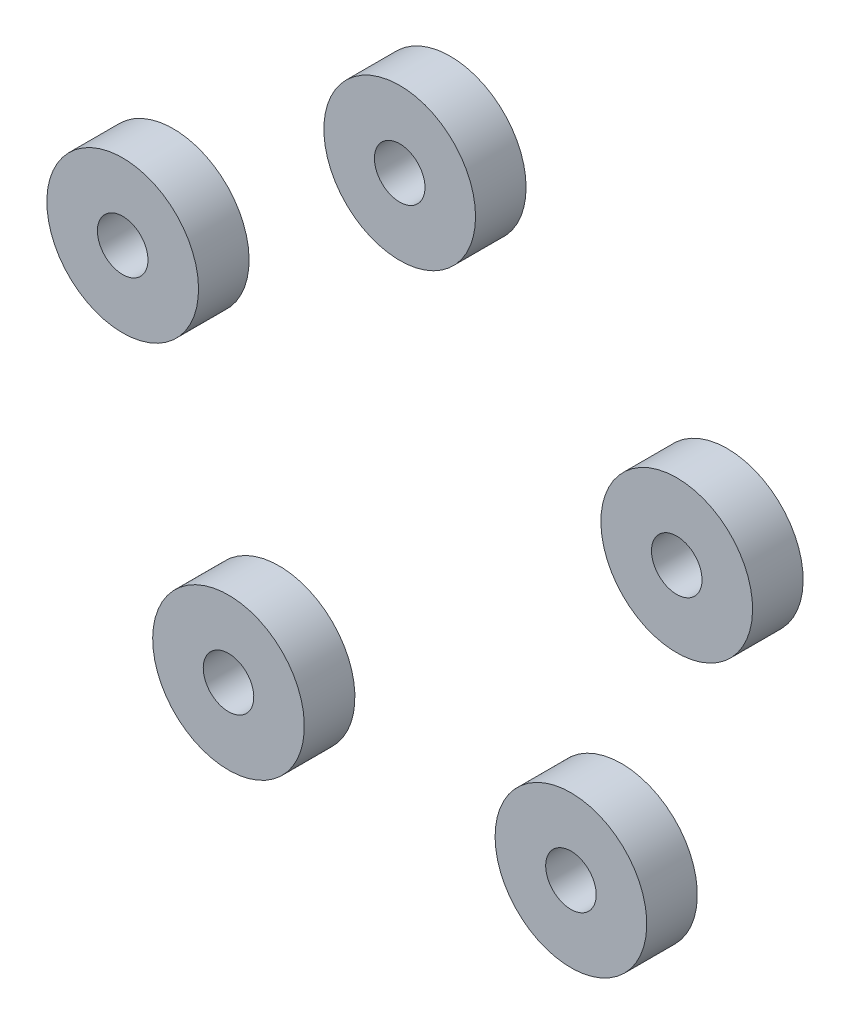
ISO-10303-21;
HEADER;
FILE_DESCRIPTION(('STEP AP214'),'2;1');
FILE_NAME('part.step','',(''),(''),'','','');
FILE_SCHEMA(('AUTOMOTIVE_DESIGN { 1 0 10303 214 1 1 1 1 }'));
ENDSEC;
DATA;
#1=APPLICATION_CONTEXT('core data for automotive mechanical design processes');
#2=APPLICATION_PROTOCOL_DEFINITION('international standard','automotive_design',2000,#1);
#3=PRODUCT_CONTEXT('',#1,'mechanical');
#4=PRODUCT('Part','Part','',(#3));
#5=PRODUCT_RELATED_PRODUCT_CATEGORY('part','',(#4));
#6=PRODUCT_DEFINITION_FORMATION('','',#4);
#7=PRODUCT_DEFINITION_CONTEXT('part definition',#1,'design');
#8=PRODUCT_DEFINITION('design','',#6,#7);
#9=PRODUCT_DEFINITION_SHAPE('','',#8);
#10=(LENGTH_UNIT() NAMED_UNIT(*) SI_UNIT(.MILLI.,.METRE.));
#11=(NAMED_UNIT(*) PLANE_ANGLE_UNIT() SI_UNIT($,.RADIAN.));
#12=(NAMED_UNIT(*) SI_UNIT($,.STERADIAN.) SOLID_ANGLE_UNIT());
#13=UNCERTAINTY_MEASURE_WITH_UNIT(LENGTH_MEASURE(1.E-05),#10,'distance_accuracy_value','');
#14=(GEOMETRIC_REPRESENTATION_CONTEXT(3) GLOBAL_UNCERTAINTY_ASSIGNED_CONTEXT((#13)) GLOBAL_UNIT_ASSIGNED_CONTEXT((#10,
#11,#12)) REPRESENTATION_CONTEXT('',''));
#15=CARTESIAN_POINT('',(0.,0.,0.));
#16=DIRECTION('',(0.,0.,1.));
#17=DIRECTION('',(1.,0.,0.));
#18=AXIS2_PLACEMENT_3D('',#15,#16,#17);
#19=CARTESIAN_POINT('',(-0.000964230025357615,23.8101388008813,6.));
#20=DIRECTION('',(0.,0.,1.));
#21=DIRECTION('',(1.,0.,0.));
#22=AXIS2_PLACEMENT_3D('',#19,#20,#21);
#23=PLANE('',#22);
#24=CARTESIAN_POINT('',(-0.000964230025357613,23.0462760167501,6.));
#25=DIRECTION('',(0.,0.,1.));
#26=DIRECTION('',(-1.,0.,0.));
#27=AXIS2_PLACEMENT_3D('',#24,#25,#26);
#28=CIRCLE('',#27,6.);
#29=CARTESIAN_POINT('',(5.99903576997464,23.0462760167501,6.));
#30=VERTEX_POINT('',#29);
#31=EDGE_CURVE('P0_E11',#30,#30,#28,.T.);
#32=ORIENTED_EDGE('',*,*,#31,.T.);
#33=EDGE_LOOP('',(#32));
#34=FACE_BOUND('',#33,.T.);
#35=CARTESIAN_POINT('',(-0.000964230025357613,23.0462760167501,6.));
#36=DIRECTION('',(0.,0.,-1.));
#37=DIRECTION('',(-1.,0.,0.));
#38=AXIS2_PLACEMENT_3D('',#35,#36,#37);
#39=CIRCLE('',#38,2.);
#40=CARTESIAN_POINT('',(1.99903576997464,23.0462760167501,6.));
#41=VERTEX_POINT('',#40);
#42=EDGE_CURVE('P0_E26',#41,#41,#39,.T.);
#43=ORIENTED_EDGE('',*,*,#42,.T.);
#44=EDGE_LOOP('',(#43));
#45=FACE_BOUND('',#44,.T.);
#46=ADVANCED_FACE('P0_F16',(#34,#45),#23,.T.);
#47=CARTESIAN_POINT('',(-0.000964230025357613,23.0462760167501,2.));
#48=DIRECTION('',(0.,0.,1.));
#49=DIRECTION('',(-1.,0.,0.));
#50=AXIS2_PLACEMENT_3D('',#47,#48,#49);
#51=CYLINDRICAL_SURFACE('',#50,6.);
#52=ORIENTED_EDGE('',*,*,#31,.F.);
#53=DIRECTION('',(0.,0.,-1.));
#54=VECTOR('',#53,1.);
#55=CARTESIAN_POINT('',(5.99903576997464,23.0462760167501,2.));
#56=LINE('',#55,#54);
#57=CARTESIAN_POINT('',(5.99903576997464,23.0462760167501,2.));
#58=VERTEX_POINT('',#57);
#59=EDGE_CURVE('P0_E66',#30,#58,#56,.T.);
#60=ORIENTED_EDGE('',*,*,#59,.T.);
#61=CARTESIAN_POINT('',(-0.000964230025357613,23.0462760167501,2.));
#62=DIRECTION('',(0.,0.,1.));
#63=DIRECTION('',(-1.,0.,0.));
#64=AXIS2_PLACEMENT_3D('',#61,#62,#63);
#65=CIRCLE('',#64,6.);
#66=EDGE_CURVE('P0_E60',#58,#58,#65,.T.);
#67=ORIENTED_EDGE('',*,*,#66,.T.);
#68=ORIENTED_EDGE('',*,*,#59,.F.);
#69=EDGE_LOOP('',(#52,#60,#67,#68));
#70=FACE_BOUND('',#69,.T.);
#71=ADVANCED_FACE('P0_F78',(#70),#51,.T.);
#72=CARTESIAN_POINT('',(-0.000964230025357613,23.0462760167501,2.));
#73=DIRECTION('',(0.,0.,1.));
#74=DIRECTION('',(-1.,0.,0.));
#75=AXIS2_PLACEMENT_3D('',#72,#73,#74);
#76=CYLINDRICAL_SURFACE('',#75,2.);
#77=ORIENTED_EDGE('',*,*,#42,.F.);
#78=DIRECTION('',(0.,0.,-1.));
#79=VECTOR('',#78,1.);
#80=CARTESIAN_POINT('',(1.99903576997464,23.0462760167501,2.));
#81=LINE('',#80,#79);
#82=CARTESIAN_POINT('',(1.99903576997464,23.0462760167501,2.));
#83=VERTEX_POINT('',#82);
#84=EDGE_CURVE('P0_E20',#41,#83,#81,.T.);
#85=ORIENTED_EDGE('',*,*,#84,.T.);
#86=CARTESIAN_POINT('',(-0.000964230025357613,23.0462760167501,2.));
#87=DIRECTION('',(0.,0.,-1.));
#88=DIRECTION('',(-1.,0.,0.));
#89=AXIS2_PLACEMENT_3D('',#86,#87,#88);
#90=CIRCLE('',#89,2.);
#91=EDGE_CURVE('P0_E56',#83,#83,#90,.T.);
#92=ORIENTED_EDGE('',*,*,#91,.T.);
#93=ORIENTED_EDGE('',*,*,#84,.F.);
#94=EDGE_LOOP('',(#77,#85,#92,#93));
#95=FACE_BOUND('',#94,.T.);
#96=ADVANCED_FACE('P0_F58',(#95),#76,.F.);
#97=CARTESIAN_POINT('',(-0.000964230025357615,23.8101388008813,2.));
#98=DIRECTION('',(0.,0.,1.));
#99=DIRECTION('',(1.,0.,0.));
#100=AXIS2_PLACEMENT_3D('',#97,#98,#99);
#101=PLANE('',#100);
#102=ORIENTED_EDGE('',*,*,#66,.F.);
#103=EDGE_LOOP('',(#102));
#104=FACE_BOUND('',#103,.T.);
#105=ORIENTED_EDGE('',*,*,#91,.F.);
#106=EDGE_LOOP('',(#105));
#107=FACE_BOUND('',#106,.T.);
#108=ADVANCED_FACE('P0_F18',(#104,#107),#101,.F.);
#109=CLOSED_SHELL('',(#46,#71,#96,#108));
#110=MANIFOLD_SOLID_BREP('P0_B1',#109);
#111=CARTESIAN_POINT('',(-22.6450856239346,7.35682049064984,6.));
#112=DIRECTION('',(0.,0.,1.));
#113=DIRECTION('',(1.,0.,0.));
#114=AXIS2_PLACEMENT_3D('',#111,#112,#113);
#115=PLANE('',#114);
#116=CARTESIAN_POINT('',(-21.9186089455312,7.12077390898274,6.));
#117=DIRECTION('',(0.,0.,1.));
#118=DIRECTION('',(-0.309016994374948,-0.951056516295154,0.));
#119=AXIS2_PLACEMENT_3D('',#116,#117,#118);
#120=CIRCLE('',#119,6.);
#121=CARTESIAN_POINT('',(-20.0645069792816,12.8271130067537,6.));
#122=VERTEX_POINT('',#121);
#123=EDGE_CURVE('P1_E11',#122,#122,#120,.T.);
#124=ORIENTED_EDGE('',*,*,#123,.T.);
#125=EDGE_LOOP('',(#124));
#126=FACE_BOUND('',#125,.T.);
#127=CARTESIAN_POINT('',(-21.9186089455312,7.12077390898274,6.));
#128=DIRECTION('',(0.,0.,-1.));
#129=DIRECTION('',(-0.309016994374948,-0.951056516295154,0.));
#130=AXIS2_PLACEMENT_3D('',#127,#128,#129);
#131=CIRCLE('',#130,2.);
#132=CARTESIAN_POINT('',(-21.3005749567813,9.02288694157304,6.));
#133=VERTEX_POINT('',#132);
#134=EDGE_CURVE('P1_E26',#133,#133,#131,.T.);
#135=ORIENTED_EDGE('',*,*,#134,.T.);
#136=EDGE_LOOP('',(#135));
#137=FACE_BOUND('',#136,.T.);
#138=ADVANCED_FACE('P1_F16',(#126,#137),#115,.T.);
#139=CARTESIAN_POINT('',(-21.9186089455312,7.12077390898274,2.));
#140=DIRECTION('',(0.,0.,1.));
#141=DIRECTION('',(-0.309016994374948,-0.951056516295154,0.));
#142=AXIS2_PLACEMENT_3D('',#139,#140,#141);
#143=CYLINDRICAL_SURFACE('',#142,6.);
#144=ORIENTED_EDGE('',*,*,#123,.F.);
#145=DIRECTION('',(0.,0.,-1.));
#146=VECTOR('',#145,1.);
#147=CARTESIAN_POINT('',(-20.0645069792816,12.8271130067537,2.));
#148=LINE('',#147,#146);
#149=CARTESIAN_POINT('',(-20.0645069792816,12.8271130067537,2.));
#150=VERTEX_POINT('',#149);
#151=EDGE_CURVE('P1_E19',#122,#150,#148,.T.);
#152=ORIENTED_EDGE('',*,*,#151,.T.);
#153=CARTESIAN_POINT('',(-21.9186089455312,7.12077390898274,2.));
#154=DIRECTION('',(0.,0.,1.));
#155=DIRECTION('',(-0.309016994374948,-0.951056516295154,0.));
#156=AXIS2_PLACEMENT_3D('',#153,#154,#155);
#157=CIRCLE('',#156,6.);
#158=EDGE_CURVE('P1_E47',#150,#150,#157,.T.);
#159=ORIENTED_EDGE('',*,*,#158,.T.);
#160=ORIENTED_EDGE('',*,*,#151,.F.);
#161=EDGE_LOOP('',(#144,#152,#159,#160));
#162=FACE_BOUND('',#161,.T.);
#163=ADVANCED_FACE('P1_F78',(#162),#143,.T.);
#164=CARTESIAN_POINT('',(-21.9186089455312,7.12077390898274,2.));
#165=DIRECTION('',(0.,0.,1.));
#166=DIRECTION('',(-0.309016994374948,-0.951056516295154,0.));
#167=AXIS2_PLACEMENT_3D('',#164,#165,#166);
#168=CYLINDRICAL_SURFACE('',#167,2.);
#169=ORIENTED_EDGE('',*,*,#134,.F.);
#170=DIRECTION('',(0.,0.,-1.));
#171=VECTOR('',#170,1.);
#172=CARTESIAN_POINT('',(-21.3005749567813,9.02288694157304,2.));
#173=LINE('',#172,#171);
#174=CARTESIAN_POINT('',(-21.3005749567813,9.02288694157304,2.));
#175=VERTEX_POINT('',#174);
#176=EDGE_CURVE('P1_E60',#133,#175,#173,.T.);
#177=ORIENTED_EDGE('',*,*,#176,.T.);
#178=CARTESIAN_POINT('',(-21.9186089455312,7.12077390898274,2.));
#179=DIRECTION('',(0.,0.,-1.));
#180=DIRECTION('',(-0.309016994374948,-0.951056516295154,0.));
#181=AXIS2_PLACEMENT_3D('',#178,#179,#180);
#182=CIRCLE('',#181,2.);
#183=EDGE_CURVE('P1_E54',#175,#175,#182,.T.);
#184=ORIENTED_EDGE('',*,*,#183,.T.);
#185=ORIENTED_EDGE('',*,*,#176,.F.);
#186=EDGE_LOOP('',(#169,#177,#184,#185));
#187=FACE_BOUND('',#186,.T.);
#188=ADVANCED_FACE('P1_F62',(#187),#168,.F.);
#189=CARTESIAN_POINT('',(-22.6450856239346,7.35682049064984,2.));
#190=DIRECTION('',(0.,0.,1.));
#191=DIRECTION('',(1.,0.,0.));
#192=AXIS2_PLACEMENT_3D('',#189,#190,#191);
#193=PLANE('',#192);
#194=ORIENTED_EDGE('',*,*,#158,.F.);
#195=EDGE_LOOP('',(#194));
#196=FACE_BOUND('',#195,.T.);
#197=ORIENTED_EDGE('',*,*,#183,.F.);
#198=EDGE_LOOP('',(#197));
#199=FACE_BOUND('',#198,.T.);
#200=ADVANCED_FACE('P1_F56',(#196,#199),#193,.F.);
#201=CLOSED_SHELL('',(#138,#163,#188,#200));
#202=MANIFOLD_SOLID_BREP('P1_B1',#201);
#203=CARTESIAN_POINT('',(-13.9944683637178,-19.263373688528,6.));
#204=DIRECTION('',(0.,0.,1.));
#205=DIRECTION('',(1.,0.,0.));
#206=AXIS2_PLACEMENT_3D('',#203,#204,#205);
#207=PLANE('',#206);
#208=CARTESIAN_POINT('',(-13.5454810844304,-18.6453957147953,6.));
#209=DIRECTION('',(0.,0.,1.));
#210=DIRECTION('',(0.809016994374948,-0.587785252292473,0.));
#211=AXIS2_PLACEMENT_3D('',#208,#209,#210);
#212=CIRCLE('',#211,6.);
#213=CARTESIAN_POINT('',(-18.3995830506801,-15.1186842010405,6.));
#214=VERTEX_POINT('',#213);
#215=EDGE_CURVE('P2_E11',#214,#214,#212,.T.);
#216=ORIENTED_EDGE('',*,*,#215,.T.);
#217=EDGE_LOOP('',(#216));
#218=FACE_BOUND('',#217,.T.);
#219=CARTESIAN_POINT('',(-13.5454810844304,-18.6453957147953,6.));
#220=DIRECTION('',(0.,0.,-1.));
#221=DIRECTION('',(0.809016994374947,-0.587785252292473,0.));
#222=AXIS2_PLACEMENT_3D('',#219,#220,#221);
#223=CIRCLE('',#222,2.);
#224=CARTESIAN_POINT('',(-15.1635150731803,-17.4698252102104,6.));
#225=VERTEX_POINT('',#224);
#226=EDGE_CURVE('P2_E27',#225,#225,#223,.T.);
#227=ORIENTED_EDGE('',*,*,#226,.T.);
#228=EDGE_LOOP('',(#227));
#229=FACE_BOUND('',#228,.T.);
#230=ADVANCED_FACE('P2_F16',(#218,#229),#207,.T.);
#231=CARTESIAN_POINT('',(-13.5454810844304,-18.6453957147953,2.));
#232=DIRECTION('',(0.,0.,1.));
#233=DIRECTION('',(0.809016994374948,-0.587785252292473,0.));
#234=AXIS2_PLACEMENT_3D('',#231,#232,#233);
#235=CYLINDRICAL_SURFACE('',#234,6.);
#236=ORIENTED_EDGE('',*,*,#215,.F.);
#237=DIRECTION('',(0.,0.,-1.));
#238=VECTOR('',#237,1.);
#239=CARTESIAN_POINT('',(-18.3995830506801,-15.1186842010405,2.));
#240=LINE('',#239,#238);
#241=CARTESIAN_POINT('',(-18.3995830506801,-15.1186842010405,2.));
#242=VERTEX_POINT('',#241);
#243=EDGE_CURVE('P2_E67',#214,#242,#240,.T.);
#244=ORIENTED_EDGE('',*,*,#243,.T.);
#245=CARTESIAN_POINT('',(-13.5454810844304,-18.6453957147953,2.));
#246=DIRECTION('',(0.,0.,1.));
#247=DIRECTION('',(0.809016994374948,-0.587785252292473,0.));
#248=AXIS2_PLACEMENT_3D('',#245,#246,#247);
#249=CIRCLE('',#248,6.);
#250=EDGE_CURVE('P2_E48',#242,#242,#249,.T.);
#251=ORIENTED_EDGE('',*,*,#250,.T.);
#252=ORIENTED_EDGE('',*,*,#243,.F.);
#253=EDGE_LOOP('',(#236,#244,#251,#252));
#254=FACE_BOUND('',#253,.T.);
#255=ADVANCED_FACE('P2_F75',(#254),#235,.T.);
#256=CARTESIAN_POINT('',(-13.5454810844304,-18.6453957147953,2.));
#257=DIRECTION('',(0.,0.,1.));
#258=DIRECTION('',(0.809016994374947,-0.587785252292473,0.));
#259=AXIS2_PLACEMENT_3D('',#256,#257,#258);
#260=CYLINDRICAL_SURFACE('',#259,2.);
#261=ORIENTED_EDGE('',*,*,#226,.F.);
#262=DIRECTION('',(0.,0.,-1.));
#263=VECTOR('',#262,1.);
#264=CARTESIAN_POINT('',(-15.1635150731803,-17.4698252102104,2.));
#265=LINE('',#264,#263);
#266=CARTESIAN_POINT('',(-15.1635150731803,-17.4698252102104,2.));
#267=VERTEX_POINT('',#266);
#268=EDGE_CURVE('P2_E59',#225,#267,#265,.T.);
#269=ORIENTED_EDGE('',*,*,#268,.T.);
#270=CARTESIAN_POINT('',(-13.5454810844304,-18.6453957147953,2.));
#271=DIRECTION('',(0.,0.,-1.));
#272=DIRECTION('',(0.809016994374947,-0.587785252292473,0.));
#273=AXIS2_PLACEMENT_3D('',#270,#271,#272);
#274=CIRCLE('',#273,2.);
#275=EDGE_CURVE('P2_E20',#267,#267,#274,.T.);
#276=ORIENTED_EDGE('',*,*,#275,.T.);
#277=ORIENTED_EDGE('',*,*,#268,.F.);
#278=EDGE_LOOP('',(#261,#269,#276,#277));
#279=FACE_BOUND('',#278,.T.);
#280=ADVANCED_FACE('P2_F18',(#279),#260,.F.);
#281=CARTESIAN_POINT('',(-13.9944683637178,-19.263373688528,2.));
#282=DIRECTION('',(0.,0.,1.));
#283=DIRECTION('',(1.,0.,0.));
#284=AXIS2_PLACEMENT_3D('',#281,#282,#283);
#285=PLANE('',#284);
#286=ORIENTED_EDGE('',*,*,#250,.F.);
#287=EDGE_LOOP('',(#286));
#288=FACE_BOUND('',#287,.T.);
#289=ORIENTED_EDGE('',*,*,#275,.F.);
#290=EDGE_LOOP('',(#289));
#291=FACE_BOUND('',#290,.T.);
#292=ADVANCED_FACE('P2_F55',(#288,#291),#285,.F.);
#293=CLOSED_SHELL('',(#230,#255,#280,#292));
#294=MANIFOLD_SOLID_BREP('P2_B1',#293);
#295=CARTESIAN_POINT('',(22.6444896970059,7.35865456514748,6.));
#296=DIRECTION('',(0.,0.,1.));
#297=DIRECTION('',(1.,0.,0.));
#298=AXIS2_PLACEMENT_3D('',#295,#296,#297);
#299=PLANE('',#298);
#300=CARTESIAN_POINT('',(21.9180130186026,7.12260798348038,6.));
#301=DIRECTION('',(0.,0.,1.));
#302=DIRECTION('',(-0.309016994374947,0.951056516295154,0.));
#303=AXIS2_PLACEMENT_3D('',#300,#301,#302);
#304=CIRCLE('',#303,6.);
#305=CARTESIAN_POINT('',(23.7721149848523,1.41626888570945,6.));
#306=VERTEX_POINT('',#305);
#307=EDGE_CURVE('P3_E11',#306,#306,#304,.T.);
#308=ORIENTED_EDGE('',*,*,#307,.T.);
#309=EDGE_LOOP('',(#308));
#310=FACE_BOUND('',#309,.T.);
#311=CARTESIAN_POINT('',(21.9180130186026,7.12260798348038,6.));
#312=DIRECTION('',(0.,0.,-1.));
#313=DIRECTION('',(-0.309016994374947,0.951056516295154,0.));
#314=AXIS2_PLACEMENT_3D('',#311,#312,#313);
#315=CIRCLE('',#314,2.);
#316=CARTESIAN_POINT('',(22.5360470073525,5.22049495089007,6.));
#317=VERTEX_POINT('',#316);
#318=EDGE_CURVE('P3_E26',#317,#317,#315,.T.);
#319=ORIENTED_EDGE('',*,*,#318,.T.);
#320=EDGE_LOOP('',(#319));
#321=FACE_BOUND('',#320,.T.);
#322=ADVANCED_FACE('P3_F16',(#310,#321),#299,.T.);
#323=CARTESIAN_POINT('',(21.9180130186026,7.12260798348038,2.));
#324=DIRECTION('',(0.,0.,1.));
#325=DIRECTION('',(-0.309016994374947,0.951056516295154,0.));
#326=AXIS2_PLACEMENT_3D('',#323,#324,#325);
#327=CYLINDRICAL_SURFACE('',#326,6.);
#328=ORIENTED_EDGE('',*,*,#307,.F.);
#329=DIRECTION('',(0.,0.,-1.));
#330=VECTOR('',#329,1.);
#331=CARTESIAN_POINT('',(23.7721149848523,1.41626888570945,2.));
#332=LINE('',#331,#330);
#333=CARTESIAN_POINT('',(23.7721149848523,1.41626888570945,2.));
#334=VERTEX_POINT('',#333);
#335=EDGE_CURVE('P3_E20',#306,#334,#332,.T.);
#336=ORIENTED_EDGE('',*,*,#335,.T.);
#337=CARTESIAN_POINT('',(21.9180130186026,7.12260798348038,2.));
#338=DIRECTION('',(0.,0.,1.));
#339=DIRECTION('',(-0.309016994374947,0.951056516295154,0.));
#340=AXIS2_PLACEMENT_3D('',#337,#338,#339);
#341=CIRCLE('',#340,6.);
#342=EDGE_CURVE('P3_E61',#334,#334,#341,.T.);
#343=ORIENTED_EDGE('',*,*,#342,.T.);
#344=ORIENTED_EDGE('',*,*,#335,.F.);
#345=EDGE_LOOP('',(#328,#336,#343,#344));
#346=FACE_BOUND('',#345,.T.);
#347=ADVANCED_FACE('P3_F77',(#346),#327,.T.);
#348=CARTESIAN_POINT('',(21.9180130186026,7.12260798348038,2.));
#349=DIRECTION('',(0.,0.,1.));
#350=DIRECTION('',(-0.309016994374947,0.951056516295154,0.));
#351=AXIS2_PLACEMENT_3D('',#348,#349,#350);
#352=CYLINDRICAL_SURFACE('',#351,2.);
#353=ORIENTED_EDGE('',*,*,#318,.F.);
#354=DIRECTION('',(0.,0.,-1.));
#355=VECTOR('',#354,1.);
#356=CARTESIAN_POINT('',(22.5360470073525,5.22049495089007,2.));
#357=LINE('',#356,#355);
#358=CARTESIAN_POINT('',(22.5360470073525,5.22049495089007,2.));
#359=VERTEX_POINT('',#358);
#360=EDGE_CURVE('P3_E59',#317,#359,#357,.T.);
#361=ORIENTED_EDGE('',*,*,#360,.T.);
#362=CARTESIAN_POINT('',(21.9180130186026,7.12260798348038,2.));
#363=DIRECTION('',(0.,0.,-1.));
#364=DIRECTION('',(-0.309016994374947,0.951056516295154,0.));
#365=AXIS2_PLACEMENT_3D('',#362,#363,#364);
#366=CIRCLE('',#365,2.);
#367=EDGE_CURVE('P3_E56',#359,#359,#366,.T.);
#368=ORIENTED_EDGE('',*,*,#367,.T.);
#369=ORIENTED_EDGE('',*,*,#360,.F.);
#370=EDGE_LOOP('',(#353,#361,#368,#369));
#371=FACE_BOUND('',#370,.T.);
#372=ADVANCED_FACE('P3_F18',(#371),#352,.F.);
#373=CARTESIAN_POINT('',(22.6444896970059,7.35865456514748,2.));
#374=DIRECTION('',(0.,0.,1.));
#375=DIRECTION('',(1.,0.,0.));
#376=AXIS2_PLACEMENT_3D('',#373,#374,#375);
#377=PLANE('',#376);
#378=ORIENTED_EDGE('',*,*,#342,.F.);
#379=EDGE_LOOP('',(#378));
#380=FACE_BOUND('',#379,.T.);
#381=ORIENTED_EDGE('',*,*,#367,.F.);
#382=EDGE_LOOP('',(#381));
#383=FACE_BOUND('',#382,.T.);
#384=ADVANCED_FACE('P3_F57',(#380,#383),#377,.F.);
#385=CLOSED_SHELL('',(#322,#347,#372,#384));
#386=MANIFOLD_SOLID_BREP('P3_B1',#385);
#387=CARTESIAN_POINT('',(13.9960285206718,-19.2622401681506,6.));
#388=DIRECTION('',(0.,0.,1.));
#389=DIRECTION('',(1.,0.,0.));
#390=AXIS2_PLACEMENT_3D('',#387,#388,#389);
#391=PLANE('',#390);
#392=CARTESIAN_POINT('',(13.5470412413844,-18.6442621944179,6.));
#393=DIRECTION('',(0.,0.,1.));
#394=DIRECTION('',(0.809016994374948,0.587785252292473,0.));
#395=AXIS2_PLACEMENT_3D('',#392,#393,#394);
#396=CIRCLE('',#395,6.);
#397=CARTESIAN_POINT('',(8.69293927513476,-22.1709737081727,6.));
#398=VERTEX_POINT('',#397);
#399=EDGE_CURVE('P4_E11',#398,#398,#396,.T.);
#400=ORIENTED_EDGE('',*,*,#399,.T.);
#401=EDGE_LOOP('',(#400));
#402=FACE_BOUND('',#401,.T.);
#403=CARTESIAN_POINT('',(13.5470412413844,-18.6442621944179,6.));
#404=DIRECTION('',(0.,0.,-1.));
#405=DIRECTION('',(0.809016994374948,0.587785252292473,0.));
#406=AXIS2_PLACEMENT_3D('',#403,#404,#405);
#407=CIRCLE('',#406,2.);
#408=CARTESIAN_POINT('',(11.9290072526345,-19.8198326990028,6.));
#409=VERTEX_POINT('',#408);
#410=EDGE_CURVE('P4_E27',#409,#409,#407,.T.);
#411=ORIENTED_EDGE('',*,*,#410,.T.);
#412=EDGE_LOOP('',(#411));
#413=FACE_BOUND('',#412,.T.);
#414=ADVANCED_FACE('P4_F16',(#402,#413),#391,.T.);
#415=CARTESIAN_POINT('',(13.5470412413844,-18.6442621944179,2.));
#416=DIRECTION('',(0.,0.,1.));
#417=DIRECTION('',(0.809016994374948,0.587785252292473,0.));
#418=AXIS2_PLACEMENT_3D('',#415,#416,#417);
#419=CYLINDRICAL_SURFACE('',#418,6.);
#420=ORIENTED_EDGE('',*,*,#399,.F.);
#421=DIRECTION('',(0.,0.,-1.));
#422=VECTOR('',#421,1.);
#423=CARTESIAN_POINT('',(8.69293927513476,-22.1709737081727,2.));
#424=LINE('',#423,#422);
#425=CARTESIAN_POINT('',(8.69293927513476,-22.1709737081727,2.));
#426=VERTEX_POINT('',#425);
#427=EDGE_CURVE('P4_E56',#398,#426,#424,.T.);
#428=ORIENTED_EDGE('',*,*,#427,.T.);
#429=CARTESIAN_POINT('',(13.5470412413844,-18.6442621944179,2.));
#430=DIRECTION('',(0.,0.,1.));
#431=DIRECTION('',(0.809016994374948,0.587785252292473,0.));
#432=AXIS2_PLACEMENT_3D('',#429,#430,#431);
#433=CIRCLE('',#432,6.);
#434=EDGE_CURVE('P4_E54',#426,#426,#433,.T.);
#435=ORIENTED_EDGE('',*,*,#434,.T.);
#436=ORIENTED_EDGE('',*,*,#427,.F.);
#437=EDGE_LOOP('',(#420,#428,#435,#436));
#438=FACE_BOUND('',#437,.T.);
#439=ADVANCED_FACE('P4_F59',(#438),#419,.T.);
#440=CARTESIAN_POINT('',(13.5470412413844,-18.6442621944179,2.));
#441=DIRECTION('',(0.,0.,1.));
#442=DIRECTION('',(0.809016994374948,0.587785252292473,0.));
#443=AXIS2_PLACEMENT_3D('',#440,#441,#442);
#444=CYLINDRICAL_SURFACE('',#443,2.);
#445=ORIENTED_EDGE('',*,*,#410,.F.);
#446=DIRECTION('',(0.,0.,-1.));
#447=VECTOR('',#446,1.);
#448=CARTESIAN_POINT('',(11.9290072526345,-19.8198326990028,2.));
#449=LINE('',#448,#447);
#450=CARTESIAN_POINT('',(11.9290072526345,-19.8198326990028,2.));
#451=VERTEX_POINT('',#450);
#452=EDGE_CURVE('P4_E57',#409,#451,#449,.T.);
#453=ORIENTED_EDGE('',*,*,#452,.T.);
#454=CARTESIAN_POINT('',(13.5470412413844,-18.6442621944179,2.));
#455=DIRECTION('',(0.,0.,-1.));
#456=DIRECTION('',(0.809016994374948,0.587785252292473,0.));
#457=AXIS2_PLACEMENT_3D('',#454,#455,#456);
#458=CIRCLE('',#457,2.);
#459=EDGE_CURVE('P4_E20',#451,#451,#458,.T.);
#460=ORIENTED_EDGE('',*,*,#459,.T.);
#461=ORIENTED_EDGE('',*,*,#452,.F.);
#462=EDGE_LOOP('',(#445,#453,#460,#461));
#463=FACE_BOUND('',#462,.T.);
#464=ADVANCED_FACE('P4_F76',(#463),#444,.F.);
#465=CARTESIAN_POINT('',(13.9960285206718,-19.2622401681506,2.));
#466=DIRECTION('',(0.,0.,1.));
#467=DIRECTION('',(1.,0.,0.));
#468=AXIS2_PLACEMENT_3D('',#465,#466,#467);
#469=PLANE('',#468);
#470=ORIENTED_EDGE('',*,*,#434,.F.);
#471=EDGE_LOOP('',(#470));
#472=FACE_BOUND('',#471,.T.);
#473=ORIENTED_EDGE('',*,*,#459,.F.);
#474=EDGE_LOOP('',(#473));
#475=FACE_BOUND('',#474,.T.);
#476=ADVANCED_FACE('P4_F18',(#472,#475),#469,.F.);
#477=CLOSED_SHELL('',(#414,#439,#464,#476));
#478=MANIFOLD_SOLID_BREP('P4_B1',#477);
#479=ADVANCED_BREP_SHAPE_REPRESENTATION('',(#18,#110,#202,#294,#386,#478),#14);
#480=SHAPE_DEFINITION_REPRESENTATION(#9,#479);
ENDSEC;
END-ISO-10303-21;
